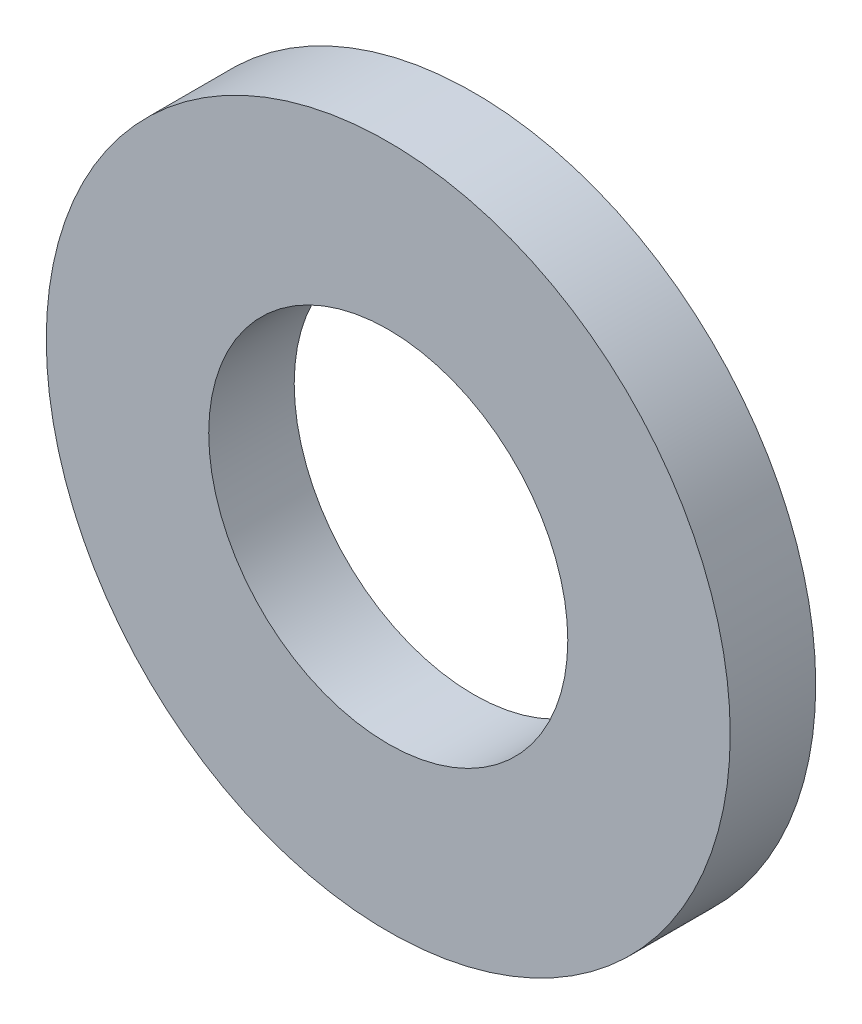
ISO-10303-21;
HEADER;
FILE_DESCRIPTION(('STEP AP214'),'2;1');
FILE_NAME('part.step','',(''),(''),'','','');
FILE_SCHEMA(('AUTOMOTIVE_DESIGN { 1 0 10303 214 1 1 1 1 }'));
ENDSEC;
DATA;
#1=APPLICATION_CONTEXT('core data for automotive mechanical design processes');
#2=APPLICATION_PROTOCOL_DEFINITION('international standard','automotive_design',2000,#1);
#3=PRODUCT_CONTEXT('',#1,'mechanical');
#4=PRODUCT('Part','Part','',(#3));
#5=PRODUCT_RELATED_PRODUCT_CATEGORY('part','',(#4));
#6=PRODUCT_DEFINITION_FORMATION('','',#4);
#7=PRODUCT_DEFINITION_CONTEXT('part definition',#1,'design');
#8=PRODUCT_DEFINITION('design','',#6,#7);
#9=PRODUCT_DEFINITION_SHAPE('','',#8);
#10=(LENGTH_UNIT() NAMED_UNIT(*) SI_UNIT(.MILLI.,.METRE.));
#11=(NAMED_UNIT(*) PLANE_ANGLE_UNIT() SI_UNIT($,.RADIAN.));
#12=(NAMED_UNIT(*) SI_UNIT($,.STERADIAN.) SOLID_ANGLE_UNIT());
#13=UNCERTAINTY_MEASURE_WITH_UNIT(LENGTH_MEASURE(1.E-05),#10,'distance_accuracy_value','');
#14=(GEOMETRIC_REPRESENTATION_CONTEXT(3) GLOBAL_UNCERTAINTY_ASSIGNED_CONTEXT((#13)) GLOBAL_UNIT_ASSIGNED_CONTEXT((#10,
#11,#12)) REPRESENTATION_CONTEXT('',''));
#15=CARTESIAN_POINT('',(0.,0.,0.));
#16=DIRECTION('',(0.,0.,1.));
#17=DIRECTION('',(1.,0.,0.));
#18=AXIS2_PLACEMENT_3D('',#15,#16,#17);
#19=CARTESIAN_POINT('',(0.,0.,0.5));
#20=DIRECTION('',(0.,0.,1.));
#21=DIRECTION('',(1.,0.,0.));
#22=AXIS2_PLACEMENT_3D('',#19,#20,#21);
#23=PLANE('',#22);
#24=CARTESIAN_POINT('',(0.,0.,0.5));
#25=DIRECTION('',(0.,0.,1.));
#26=DIRECTION('',(1.,0.,0.));
#27=AXIS2_PLACEMENT_3D('',#24,#25,#26);
#28=CIRCLE('',#27,2.);
#29=CARTESIAN_POINT('',(2.,0.,0.5));
#30=VERTEX_POINT('',#29);
#31=EDGE_CURVE('E10',#30,#30,#28,.T.);
#32=ORIENTED_EDGE('',*,*,#31,.T.);
#33=EDGE_LOOP('',(#32));
#34=FACE_BOUND('',#33,.T.);
#35=CARTESIAN_POINT('',(0.,0.,0.5));
#36=DIRECTION('',(0.,0.,1.));
#37=DIRECTION('',(1.,0.,0.));
#38=AXIS2_PLACEMENT_3D('',#35,#36,#37);
#39=CIRCLE('',#38,1.05);
#40=CARTESIAN_POINT('',(1.05,0.,0.5));
#41=VERTEX_POINT('',#40);
#42=EDGE_CURVE('E48',#41,#41,#39,.T.);
#43=ORIENTED_EDGE('',*,*,#42,.F.);
#44=EDGE_LOOP('',(#43));
#45=FACE_BOUND('',#44,.T.);
#46=ADVANCED_FACE('F40',(#34,#45),#23,.T.);
#47=CARTESIAN_POINT('',(0.,0.,0.));
#48=DIRECTION('',(0.,0.,1.));
#49=DIRECTION('',(1.,0.,0.));
#50=AXIS2_PLACEMENT_3D('',#47,#48,#49);
#51=PLANE('',#50);
#52=CARTESIAN_POINT('',(0.,0.,0.));
#53=DIRECTION('',(0.,0.,1.));
#54=DIRECTION('',(1.,0.,0.));
#55=AXIS2_PLACEMENT_3D('',#52,#53,#54);
#56=CIRCLE('',#55,2.);
#57=CARTESIAN_POINT('',(2.,0.,0.));
#58=VERTEX_POINT('',#57);
#59=EDGE_CURVE('E41',#58,#58,#56,.T.);
#60=ORIENTED_EDGE('',*,*,#59,.F.);
#61=EDGE_LOOP('',(#60));
#62=FACE_BOUND('',#61,.T.);
#63=CARTESIAN_POINT('',(0.,0.,0.));
#64=DIRECTION('',(0.,0.,1.));
#65=DIRECTION('',(1.,0.,0.));
#66=AXIS2_PLACEMENT_3D('',#63,#64,#65);
#67=CIRCLE('',#66,1.05);
#68=CARTESIAN_POINT('',(1.05,0.,0.));
#69=VERTEX_POINT('',#68);
#70=EDGE_CURVE('E49',#69,#69,#67,.T.);
#71=ORIENTED_EDGE('',*,*,#70,.T.);
#72=EDGE_LOOP('',(#71));
#73=FACE_BOUND('',#72,.T.);
#74=ADVANCED_FACE('F58',(#62,#73),#51,.F.);
#75=CARTESIAN_POINT('',(0.,0.,0.5));
#76=DIRECTION('',(0.,0.,-1.));
#77=DIRECTION('',(-1.,0.,0.));
#78=AXIS2_PLACEMENT_3D('',#75,#76,#77);
#79=CYLINDRICAL_SURFACE('',#78,2.);
#80=ORIENTED_EDGE('',*,*,#31,.F.);
#81=EDGE_LOOP('',(#80));
#82=FACE_BOUND('',#81,.T.);
#83=ORIENTED_EDGE('',*,*,#59,.T.);
#84=EDGE_LOOP('',(#83));
#85=FACE_BOUND('',#84,.T.);
#86=ADVANCED_FACE('F39',(#82,#85),#79,.T.);
#87=CARTESIAN_POINT('',(0.,0.,0.5));
#88=DIRECTION('',(0.,0.,-1.));
#89=DIRECTION('',(-1.,0.,0.));
#90=AXIS2_PLACEMENT_3D('',#87,#88,#89);
#91=CYLINDRICAL_SURFACE('',#90,1.05);
#92=ORIENTED_EDGE('',*,*,#42,.T.);
#93=EDGE_LOOP('',(#92));
#94=FACE_BOUND('',#93,.T.);
#95=ORIENTED_EDGE('',*,*,#70,.F.);
#96=EDGE_LOOP('',(#95));
#97=FACE_BOUND('',#96,.T.);
#98=ADVANCED_FACE('F57',(#94,#97),#91,.F.);
#99=CLOSED_SHELL('',(#46,#74,#86,#98));
#100=MANIFOLD_SOLID_BREP('B2',#99);
#101=ADVANCED_BREP_SHAPE_REPRESENTATION('',(#18,#100),#14);
#102=SHAPE_DEFINITION_REPRESENTATION(#9,#101);
ENDSEC;
END-ISO-10303-21;
